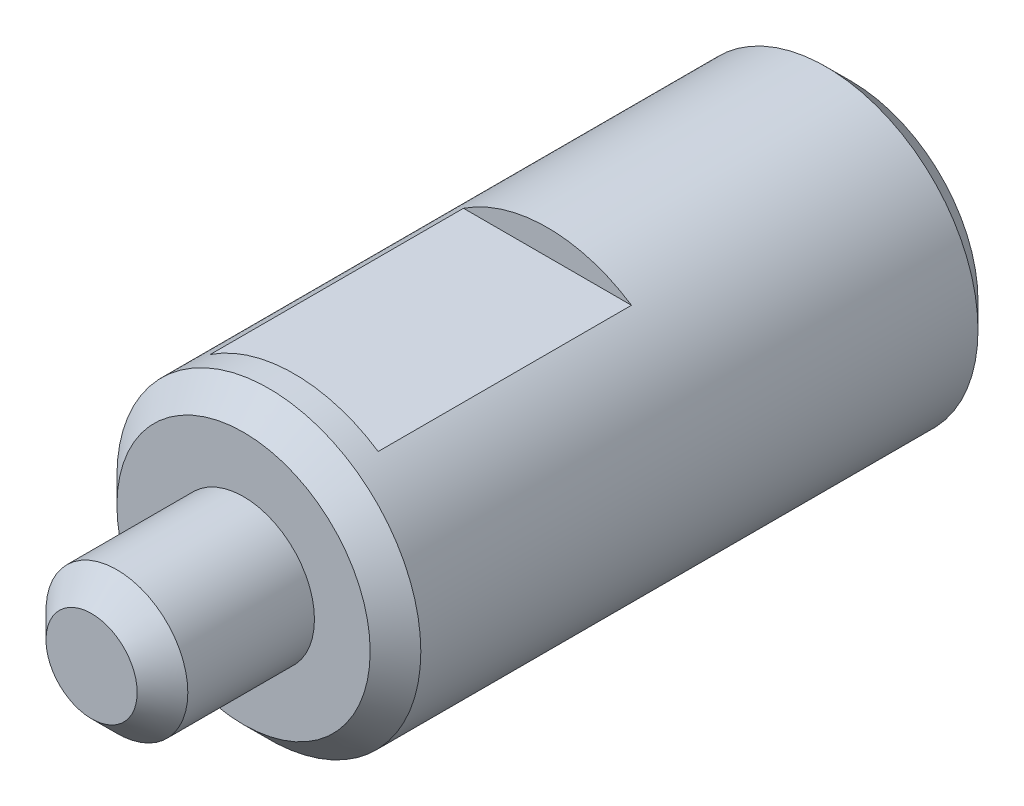
ISO-10303-21;
HEADER;
FILE_DESCRIPTION(('STEP AP214'),'2;1');
FILE_NAME('part.step','',(''),(''),'','','');
FILE_SCHEMA(('AUTOMOTIVE_DESIGN { 1 0 10303 214 1 1 1 1 }'));
ENDSEC;
DATA;
#1=APPLICATION_CONTEXT('core data for automotive mechanical design processes');
#2=APPLICATION_PROTOCOL_DEFINITION('international standard','automotive_design',2000,#1);
#3=PRODUCT_CONTEXT('',#1,'mechanical');
#4=PRODUCT('Part','Part','',(#3));
#5=PRODUCT_RELATED_PRODUCT_CATEGORY('part','',(#4));
#6=PRODUCT_DEFINITION_FORMATION('','',#4);
#7=PRODUCT_DEFINITION_CONTEXT('part definition',#1,'design');
#8=PRODUCT_DEFINITION('design','',#6,#7);
#9=PRODUCT_DEFINITION_SHAPE('','',#8);
#10=(LENGTH_UNIT() NAMED_UNIT(*) SI_UNIT(.MILLI.,.METRE.));
#11=(NAMED_UNIT(*) PLANE_ANGLE_UNIT() SI_UNIT($,.RADIAN.));
#12=(NAMED_UNIT(*) SI_UNIT($,.STERADIAN.) SOLID_ANGLE_UNIT());
#13=UNCERTAINTY_MEASURE_WITH_UNIT(LENGTH_MEASURE(1.E-05),#10,'distance_accuracy_value','');
#14=(GEOMETRIC_REPRESENTATION_CONTEXT(3) GLOBAL_UNCERTAINTY_ASSIGNED_CONTEXT((#13)) GLOBAL_UNIT_ASSIGNED_CONTEXT((#10,
#11,#12)) REPRESENTATION_CONTEXT('',''));
#15=CARTESIAN_POINT('',(0.,0.,0.));
#16=DIRECTION('',(0.,0.,1.));
#17=DIRECTION('',(1.,0.,0.));
#18=AXIS2_PLACEMENT_3D('',#15,#16,#17);
#19=CARTESIAN_POINT('',(0.,0.,12.));
#20=DIRECTION('',(0.,0.,-1.));
#21=DIRECTION('',(-1.,0.,0.));
#22=AXIS2_PLACEMENT_3D('',#19,#20,#21);
#23=CYLINDRICAL_SURFACE('',#22,3.);
#24=DIRECTION('',(0.,0.,-1.));
#25=VECTOR('',#24,1.);
#26=CARTESIAN_POINT('',(-1.6583123951777,2.5,12.));
#27=LINE('',#26,#25);
#28=CARTESIAN_POINT('',(-1.6583123951777,2.5,6.));
#29=VERTEX_POINT('',#28);
#30=CARTESIAN_POINT('',(-1.6583123951777,2.5,11.));
#31=VERTEX_POINT('',#30);
#32=EDGE_CURVE('E94',#29,#31,#27,.F.);
#33=ORIENTED_EDGE('',*,*,#32,.F.);
#34=CARTESIAN_POINT('',(0.,0.,6.));
#35=DIRECTION('',(0.,0.,-1.));
#36=DIRECTION('',(-1.,0.,0.));
#37=AXIS2_PLACEMENT_3D('',#34,#35,#36);
#38=CIRCLE('',#37,3.);
#39=CARTESIAN_POINT('',(1.6583123951777,2.5,6.));
#40=VERTEX_POINT('',#39);
#41=EDGE_CURVE('E55',#29,#40,#38,.T.);
#42=ORIENTED_EDGE('',*,*,#41,.T.);
#43=DIRECTION('',(0.,0.,-1.));
#44=VECTOR('',#43,1.);
#45=CARTESIAN_POINT('',(1.6583123951777,2.5,12.));
#46=LINE('',#45,#44);
#47=CARTESIAN_POINT('',(1.6583123951777,2.5,11.));
#48=VERTEX_POINT('',#47);
#49=EDGE_CURVE('E92',#48,#40,#46,.T.);
#50=ORIENTED_EDGE('',*,*,#49,.F.);
#51=CARTESIAN_POINT('',(0.,0.,11.));
#52=DIRECTION('',(0.,0.,1.));
#53=DIRECTION('',(1.,0.,0.));
#54=AXIS2_PLACEMENT_3D('',#51,#52,#53);
#55=CIRCLE('',#54,3.);
#56=EDGE_CURVE('E99',#48,#31,#55,.T.);
#57=ORIENTED_EDGE('',*,*,#56,.T.);
#58=EDGE_LOOP('',(#33,#42,#50,#57));
#59=FACE_BOUND('',#58,.T.);
#60=CARTESIAN_POINT('',(0.,0.,0.499999999999999));
#61=DIRECTION('',(0.,0.,1.));
#62=DIRECTION('',(1.,0.,0.));
#63=AXIS2_PLACEMENT_3D('',#60,#61,#62);
#64=CIRCLE('',#63,3.);
#65=CARTESIAN_POINT('',(3.,0.,0.499999999999999));
#66=VERTEX_POINT('',#65);
#67=EDGE_CURVE('E114',#66,#66,#64,.T.);
#68=ORIENTED_EDGE('',*,*,#67,.T.);
#69=EDGE_LOOP('',(#68));
#70=FACE_BOUND('',#69,.T.);
#71=CARTESIAN_POINT('',(0.,0.,11.5));
#72=DIRECTION('',(0.,0.,1.));
#73=DIRECTION('',(1.,0.,0.));
#74=AXIS2_PLACEMENT_3D('',#71,#72,#73);
#75=CIRCLE('',#74,3.);
#76=CARTESIAN_POINT('',(3.,0.,11.5));
#77=VERTEX_POINT('',#76);
#78=EDGE_CURVE('E117',#77,#77,#75,.F.);
#79=ORIENTED_EDGE('',*,*,#78,.T.);
#80=EDGE_LOOP('',(#79));
#81=FACE_BOUND('',#80,.T.);
#82=CARTESIAN_POINT('',(0.,0.,11.));
#83=DIRECTION('',(0.,0.,-1.));
#84=DIRECTION('',(-1.,0.,0.));
#85=AXIS2_PLACEMENT_3D('',#82,#83,#84);
#86=CIRCLE('',#85,3.);
#87=CARTESIAN_POINT('',(1.6583123951777,-2.5,11.));
#88=VERTEX_POINT('',#87);
#89=CARTESIAN_POINT('',(-1.6583123951777,-2.5,11.));
#90=VERTEX_POINT('',#89);
#91=EDGE_CURVE('E79',#88,#90,#86,.T.);
#92=ORIENTED_EDGE('',*,*,#91,.F.);
#93=DIRECTION('',(0.,0.,-1.));
#94=VECTOR('',#93,1.);
#95=CARTESIAN_POINT('',(1.6583123951777,-2.5,12.));
#96=LINE('',#95,#94);
#97=CARTESIAN_POINT('',(1.6583123951777,-2.5,6.));
#98=VERTEX_POINT('',#97);
#99=EDGE_CURVE('E42',#98,#88,#96,.F.);
#100=ORIENTED_EDGE('',*,*,#99,.F.);
#101=CARTESIAN_POINT('',(0.,0.,6.));
#102=DIRECTION('',(0.,0.,1.));
#103=DIRECTION('',(1.,0.,0.));
#104=AXIS2_PLACEMENT_3D('',#101,#102,#103);
#105=CIRCLE('',#104,3.);
#106=CARTESIAN_POINT('',(-1.6583123951777,-2.5,6.));
#107=VERTEX_POINT('',#106);
#108=EDGE_CURVE('E86',#107,#98,#105,.T.);
#109=ORIENTED_EDGE('',*,*,#108,.F.);
#110=DIRECTION('',(0.,0.,-1.));
#111=VECTOR('',#110,1.);
#112=CARTESIAN_POINT('',(-1.6583123951777,-2.5,12.));
#113=LINE('',#112,#111);
#114=EDGE_CURVE('E11',#90,#107,#113,.T.);
#115=ORIENTED_EDGE('',*,*,#114,.F.);
#116=EDGE_LOOP('',(#92,#100,#109,#115));
#117=FACE_BOUND('',#116,.T.);
#118=ADVANCED_FACE('F34',(#59,#70,#81,#117),#23,.T.);
#119=CARTESIAN_POINT('',(0.,0.,12.));
#120=DIRECTION('',(0.,0.,1.));
#121=DIRECTION('',(1.,0.,0.));
#122=AXIS2_PLACEMENT_3D('',#119,#120,#121);
#123=PLANE('',#122);
#124=CARTESIAN_POINT('',(0.,0.,12.));
#125=DIRECTION('',(0.,0.,1.));
#126=DIRECTION('',(1.,0.,0.));
#127=AXIS2_PLACEMENT_3D('',#124,#125,#126);
#128=CIRCLE('',#127,2.5);
#129=CARTESIAN_POINT('',(2.5,0.,12.));
#130=VERTEX_POINT('',#129);
#131=EDGE_CURVE('E108',#130,#130,#128,.T.);
#132=ORIENTED_EDGE('',*,*,#131,.T.);
#133=EDGE_LOOP('',(#132));
#134=FACE_BOUND('',#133,.T.);
#135=CARTESIAN_POINT('',(0.,0.,12.));
#136=DIRECTION('',(0.,0.,1.));
#137=DIRECTION('',(1.,0.,0.));
#138=AXIS2_PLACEMENT_3D('',#135,#136,#137);
#139=CIRCLE('',#138,1.4);
#140=CARTESIAN_POINT('',(1.4,0.,12.));
#141=VERTEX_POINT('',#140);
#142=EDGE_CURVE('E120',#141,#141,#139,.T.);
#143=ORIENTED_EDGE('',*,*,#142,.F.);
#144=EDGE_LOOP('',(#143));
#145=FACE_BOUND('',#144,.T.);
#146=ADVANCED_FACE('F145',(#134,#145),#123,.T.);
#147=CARTESIAN_POINT('',(0.,0.,0.));
#148=DIRECTION('',(0.,0.,1.));
#149=DIRECTION('',(1.,0.,0.));
#150=AXIS2_PLACEMENT_3D('',#147,#148,#149);
#151=PLANE('',#150);
#152=CARTESIAN_POINT('',(0.,0.,0.));
#153=DIRECTION('',(0.,0.,-1.));
#154=DIRECTION('',(-1.,0.,0.));
#155=AXIS2_PLACEMENT_3D('',#152,#153,#154);
#156=CIRCLE('',#155,1.24999999999999);
#157=CARTESIAN_POINT('',(-1.24999999999999,0.,0.));
#158=VERTEX_POINT('',#157);
#159=EDGE_CURVE('E126',#158,#158,#156,.T.);
#160=ORIENTED_EDGE('',*,*,#159,.F.);
#161=EDGE_LOOP('',(#160));
#162=FACE_BOUND('',#161,.T.);
#163=CARTESIAN_POINT('',(0.,0.,0.));
#164=DIRECTION('',(0.,0.,1.));
#165=DIRECTION('',(1.,0.,0.));
#166=AXIS2_PLACEMENT_3D('',#163,#164,#165);
#167=CIRCLE('',#166,2.5);
#168=CARTESIAN_POINT('',(2.5,0.,0.));
#169=VERTEX_POINT('',#168);
#170=EDGE_CURVE('E111',#169,#169,#167,.F.);
#171=ORIENTED_EDGE('',*,*,#170,.T.);
#172=EDGE_LOOP('',(#171));
#173=FACE_BOUND('',#172,.T.);
#174=ADVANCED_FACE('F151',(#162,#173),#151,.F.);
#175=CARTESIAN_POINT('',(0.,0.,15.));
#176=DIRECTION('',(0.,0.,-1.));
#177=DIRECTION('',(-1.,0.,0.));
#178=AXIS2_PLACEMENT_3D('',#175,#176,#177);
#179=CYLINDRICAL_SURFACE('',#178,1.4);
#180=CARTESIAN_POINT('',(0.,0.,14.5));
#181=DIRECTION('',(0.,0.,1.));
#182=DIRECTION('',(1.,0.,0.));
#183=AXIS2_PLACEMENT_3D('',#180,#181,#182);
#184=CIRCLE('',#183,1.4);
#185=CARTESIAN_POINT('',(1.4,0.,14.5));
#186=VERTEX_POINT('',#185);
#187=EDGE_CURVE('E102',#186,#186,#184,.F.);
#188=ORIENTED_EDGE('',*,*,#187,.T.);
#189=EDGE_LOOP('',(#188));
#190=FACE_BOUND('',#189,.T.);
#191=ORIENTED_EDGE('',*,*,#142,.T.);
#192=EDGE_LOOP('',(#191));
#193=FACE_BOUND('',#192,.T.);
#194=ADVANCED_FACE('F176',(#190,#193),#179,.T.);
#195=CARTESIAN_POINT('',(0.,0.,15.));
#196=DIRECTION('',(0.,0.,1.));
#197=DIRECTION('',(1.,0.,0.));
#198=AXIS2_PLACEMENT_3D('',#195,#196,#197);
#199=PLANE('',#198);
#200=CARTESIAN_POINT('',(0.,0.,15.));
#201=DIRECTION('',(0.,0.,1.));
#202=DIRECTION('',(1.,0.,0.));
#203=AXIS2_PLACEMENT_3D('',#200,#201,#202);
#204=CIRCLE('',#203,0.9);
#205=CARTESIAN_POINT('',(0.9,0.,15.));
#206=VERTEX_POINT('',#205);
#207=EDGE_CURVE('E105',#206,#206,#204,.T.);
#208=ORIENTED_EDGE('',*,*,#207,.T.);
#209=EDGE_LOOP('',(#208));
#210=FACE_BOUND('',#209,.T.);
#211=ADVANCED_FACE('F161',(#210),#199,.T.);
#212=CARTESIAN_POINT('',(0.,0.,0.499999999999999));
#213=DIRECTION('',(0.,0.,1.));
#214=DIRECTION('',(1.,0.,0.));
#215=AXIS2_PLACEMENT_3D('',#212,#213,#214);
#216=CONICAL_SURFACE('',#215,3.,0.78539816339745);
#217=ORIENTED_EDGE('',*,*,#170,.F.);
#218=EDGE_LOOP('',(#217));
#219=FACE_BOUND('',#218,.T.);
#220=ORIENTED_EDGE('',*,*,#67,.F.);
#221=EDGE_LOOP('',(#220));
#222=FACE_BOUND('',#221,.T.);
#223=ADVANCED_FACE('F158',(#219,#222),#216,.T.);
#224=CARTESIAN_POINT('',(0.,0.,12.));
#225=DIRECTION('',(0.,0.,-1.));
#226=DIRECTION('',(-1.,0.,0.));
#227=AXIS2_PLACEMENT_3D('',#224,#225,#226);
#228=CONICAL_SURFACE('',#227,2.5,0.785398163397445);
#229=ORIENTED_EDGE('',*,*,#78,.F.);
#230=EDGE_LOOP('',(#229));
#231=FACE_BOUND('',#230,.T.);
#232=ORIENTED_EDGE('',*,*,#131,.F.);
#233=EDGE_LOOP('',(#232));
#234=FACE_BOUND('',#233,.T.);
#235=ADVANCED_FACE('F160',(#231,#234),#228,.T.);
#236=CARTESIAN_POINT('',(0.,0.,15.));
#237=DIRECTION('',(0.,0.,-1.));
#238=DIRECTION('',(-1.,0.,0.));
#239=AXIS2_PLACEMENT_3D('',#236,#237,#238);
#240=CONICAL_SURFACE('',#239,0.9,0.785398163397448);
#241=ORIENTED_EDGE('',*,*,#187,.F.);
#242=EDGE_LOOP('',(#241));
#243=FACE_BOUND('',#242,.T.);
#244=ORIENTED_EDGE('',*,*,#207,.F.);
#245=EDGE_LOOP('',(#244));
#246=FACE_BOUND('',#245,.T.);
#247=ADVANCED_FACE('F36',(#243,#246),#240,.T.);
#248=CARTESIAN_POINT('',(0.,0.,7.49999999999999));
#249=DIRECTION('',(0.,0.,-1.));
#250=DIRECTION('',(-1.,0.,0.));
#251=AXIS2_PLACEMENT_3D('',#248,#249,#250);
#252=CONICAL_SURFACE('',#251,1.24999999999999,1.02974425867664);
#253=CARTESIAN_POINT('',(0.,0.,8.25107577378445));
#254=VERTEX_POINT('',#253);
#255=VERTEX_LOOP('',#254);
#256=FACE_BOUND('',#255,.T.);
#257=CARTESIAN_POINT('',(0.,0.,7.49999999999999));
#258=DIRECTION('',(0.,0.,-1.));
#259=DIRECTION('',(-1.,0.,0.));
#260=AXIS2_PLACEMENT_3D('',#257,#258,#259);
#261=CIRCLE('',#260,1.24999999999999);
#262=CARTESIAN_POINT('',(-1.24999999999999,0.,7.49999999999999));
#263=VERTEX_POINT('',#262);
#264=EDGE_CURVE('E123',#263,#263,#261,.T.);
#265=ORIENTED_EDGE('',*,*,#264,.T.);
#266=EDGE_LOOP('',(#265));
#267=FACE_BOUND('',#266,.T.);
#268=ADVANCED_FACE('F168',(#256,#267),#252,.F.);
#269=CARTESIAN_POINT('',(0.,0.,0.));
#270=DIRECTION('',(0.,0.,-1.));
#271=DIRECTION('',(-1.,0.,0.));
#272=AXIS2_PLACEMENT_3D('',#269,#270,#271);
#273=CYLINDRICAL_SURFACE('',#272,1.24999999999999);
#274=ORIENTED_EDGE('',*,*,#264,.F.);
#275=EDGE_LOOP('',(#274));
#276=FACE_BOUND('',#275,.T.);
#277=ORIENTED_EDGE('',*,*,#159,.T.);
#278=EDGE_LOOP('',(#277));
#279=FACE_BOUND('',#278,.T.);
#280=ADVANCED_FACE('F190',(#276,#279),#273,.F.);
#281=CARTESIAN_POINT('',(4.85122300386374,2.5,6.));
#282=DIRECTION('',(0.,0.,-1.));
#283=DIRECTION('',(-1.,0.,0.));
#284=AXIS2_PLACEMENT_3D('',#281,#282,#283);
#285=PLANE('',#284);
#286=DIRECTION('',(-1.,0.,0.));
#287=VECTOR('',#286,1.);
#288=CARTESIAN_POINT('',(4.85122300386374,2.5,6.));
#289=LINE('',#288,#287);
#290=EDGE_CURVE('E129',#40,#29,#289,.T.);
#291=ORIENTED_EDGE('',*,*,#290,.F.);
#292=ORIENTED_EDGE('',*,*,#41,.F.);
#293=EDGE_LOOP('',(#291,#292));
#294=FACE_BOUND('',#293,.T.);
#295=ADVANCED_FACE('F194',(#294),#285,.F.);
#296=CARTESIAN_POINT('',(4.85122300386374,2.5,11.));
#297=DIRECTION('',(0.,0.,1.));
#298=DIRECTION('',(1.,0.,0.));
#299=AXIS2_PLACEMENT_3D('',#296,#297,#298);
#300=PLANE('',#299);
#301=DIRECTION('',(1.,0.,0.));
#302=VECTOR('',#301,1.);
#303=CARTESIAN_POINT('',(4.85122300386374,2.5,11.));
#304=LINE('',#303,#302);
#305=EDGE_CURVE('E89',#31,#48,#304,.T.);
#306=ORIENTED_EDGE('',*,*,#305,.F.);
#307=ORIENTED_EDGE('',*,*,#56,.F.);
#308=EDGE_LOOP('',(#306,#307));
#309=FACE_BOUND('',#308,.T.);
#310=ADVANCED_FACE('F196',(#309),#300,.F.);
#311=CARTESIAN_POINT('',(-4.85122300386374,2.5,6.));
#312=DIRECTION('',(0.,1.,0.));
#313=DIRECTION('',(0.,0.,1.));
#314=AXIS2_PLACEMENT_3D('',#311,#312,#313);
#315=PLANE('',#314);
#316=ORIENTED_EDGE('',*,*,#49,.T.);
#317=ORIENTED_EDGE('',*,*,#290,.T.);
#318=ORIENTED_EDGE('',*,*,#32,.T.);
#319=ORIENTED_EDGE('',*,*,#305,.T.);
#320=EDGE_LOOP('',(#316,#317,#318,#319));
#321=FACE_BOUND('',#320,.T.);
#322=ADVANCED_FACE('F141',(#321),#315,.T.);
#323=CARTESIAN_POINT('',(4.85122300386374,-2.5,11.));
#324=DIRECTION('',(0.,0.,-1.));
#325=DIRECTION('',(-1.,0.,0.));
#326=AXIS2_PLACEMENT_3D('',#323,#324,#325);
#327=PLANE('',#326);
#328=DIRECTION('',(1.,0.,0.));
#329=VECTOR('',#328,1.);
#330=CARTESIAN_POINT('',(4.85122300386374,-2.5,11.));
#331=LINE('',#330,#329);
#332=EDGE_CURVE('E82',#90,#88,#331,.T.);
#333=ORIENTED_EDGE('',*,*,#332,.T.);
#334=ORIENTED_EDGE('',*,*,#91,.T.);
#335=EDGE_LOOP('',(#333,#334));
#336=FACE_BOUND('',#335,.T.);
#337=ADVANCED_FACE('F81',(#336),#327,.T.);
#338=CARTESIAN_POINT('',(4.85122300386374,-2.5,6.));
#339=DIRECTION('',(0.,0.,1.));
#340=DIRECTION('',(1.,0.,0.));
#341=AXIS2_PLACEMENT_3D('',#338,#339,#340);
#342=PLANE('',#341);
#343=DIRECTION('',(-1.,0.,0.));
#344=VECTOR('',#343,1.);
#345=CARTESIAN_POINT('',(4.85122300386374,-2.5,6.));
#346=LINE('',#345,#344);
#347=EDGE_CURVE('E48',#98,#107,#346,.T.);
#348=ORIENTED_EDGE('',*,*,#347,.T.);
#349=ORIENTED_EDGE('',*,*,#108,.T.);
#350=EDGE_LOOP('',(#348,#349));
#351=FACE_BOUND('',#350,.T.);
#352=ADVANCED_FACE('F133',(#351),#342,.T.);
#353=CARTESIAN_POINT('',(-4.85122300386374,-2.5,6.));
#354=DIRECTION('',(0.,-1.,0.));
#355=DIRECTION('',(0.,0.,1.));
#356=AXIS2_PLACEMENT_3D('',#353,#354,#355);
#357=PLANE('',#356);
#358=ORIENTED_EDGE('',*,*,#114,.T.);
#359=ORIENTED_EDGE('',*,*,#347,.F.);
#360=ORIENTED_EDGE('',*,*,#99,.T.);
#361=ORIENTED_EDGE('',*,*,#332,.F.);
#362=EDGE_LOOP('',(#358,#359,#360,#361));
#363=FACE_BOUND('',#362,.T.);
#364=ADVANCED_FACE('F88',(#363),#357,.T.);
#365=CLOSED_SHELL('',(#118,#146,#174,#194,#211,#223,#235,#247,#268,#280,#295,#310,#322,#337,
#352,#364));
#366=MANIFOLD_SOLID_BREP('B2',#365);
#367=ADVANCED_BREP_SHAPE_REPRESENTATION('',(#18,#366),#14);
#368=SHAPE_DEFINITION_REPRESENTATION(#9,#367);
ENDSEC;
END-ISO-10303-21;
